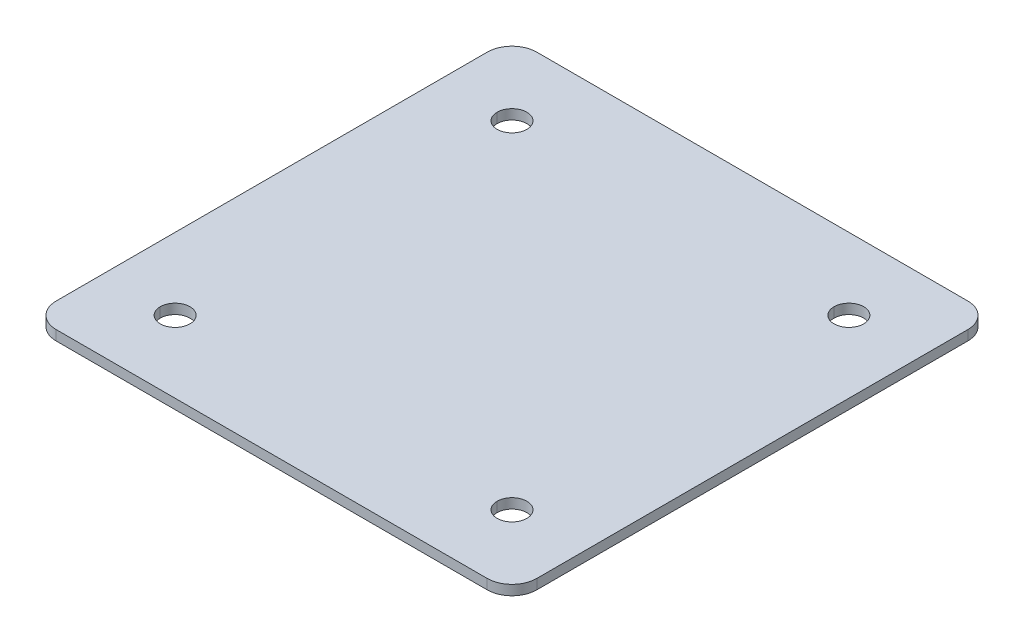
ISO-10303-21;
HEADER;
FILE_DESCRIPTION(('STEP AP214'),'2;1');
FILE_NAME('part.step','',(''),(''),'','','');
FILE_SCHEMA(('AUTOMOTIVE_DESIGN { 1 0 10303 214 1 1 1 1 }'));
ENDSEC;
DATA;
#1=APPLICATION_CONTEXT('core data for automotive mechanical design processes');
#2=APPLICATION_PROTOCOL_DEFINITION('international standard','automotive_design',2000,#1);
#3=PRODUCT_CONTEXT('',#1,'mechanical');
#4=PRODUCT('Part','Part','',(#3));
#5=PRODUCT_RELATED_PRODUCT_CATEGORY('part','',(#4));
#6=PRODUCT_DEFINITION_FORMATION('','',#4);
#7=PRODUCT_DEFINITION_CONTEXT('part definition',#1,'design');
#8=PRODUCT_DEFINITION('design','',#6,#7);
#9=PRODUCT_DEFINITION_SHAPE('','',#8);
#10=(LENGTH_UNIT() NAMED_UNIT(*) SI_UNIT(.MILLI.,.METRE.));
#11=(NAMED_UNIT(*) PLANE_ANGLE_UNIT() SI_UNIT($,.RADIAN.));
#12=(NAMED_UNIT(*) SI_UNIT($,.STERADIAN.) SOLID_ANGLE_UNIT());
#13=UNCERTAINTY_MEASURE_WITH_UNIT(LENGTH_MEASURE(1.E-05),#10,'distance_accuracy_value','');
#14=(GEOMETRIC_REPRESENTATION_CONTEXT(3) GLOBAL_UNCERTAINTY_ASSIGNED_CONTEXT((#13)) GLOBAL_UNIT_ASSIGNED_CONTEXT((#10,
#11,#12)) REPRESENTATION_CONTEXT('',''));
#15=CARTESIAN_POINT('',(0.,0.,0.));
#16=DIRECTION('',(0.,0.,1.));
#17=DIRECTION('',(1.,0.,0.));
#18=AXIS2_PLACEMENT_3D('',#15,#16,#17);
#19=CARTESIAN_POINT('',(16.,109.,34.));
#20=DIRECTION('',(0.,1.,0.));
#21=DIRECTION('',(-1.,0.,0.));
#22=AXIS2_PLACEMENT_3D('',#19,#20,#21);
#23=CYLINDRICAL_SURFACE('',#22,3.);
#24=DIRECTION('',(0.,1.,0.));
#25=VECTOR('',#24,1.);
#26=CARTESIAN_POINT('',(19.,109.,34.));
#27=LINE('',#26,#25);
#28=CARTESIAN_POINT('',(19.,109.,34.));
#29=VERTEX_POINT('',#28);
#30=CARTESIAN_POINT('',(19.,111.,34.));
#31=VERTEX_POINT('',#30);
#32=EDGE_CURVE('E327',#29,#31,#27,.T.);
#33=ORIENTED_EDGE('',*,*,#32,.F.);
#34=CARTESIAN_POINT('',(16.,109.,34.));
#35=DIRECTION('',(0.,-1.,0.));
#36=DIRECTION('',(1.,0.,0.));
#37=AXIS2_PLACEMENT_3D('',#34,#35,#36);
#38=CIRCLE('',#37,3.);
#39=CARTESIAN_POINT('',(13.,109.,34.));
#40=VERTEX_POINT('',#39);
#41=EDGE_CURVE('E178',#29,#40,#38,.T.);
#42=ORIENTED_EDGE('',*,*,#41,.T.);
#43=DIRECTION('',(0.,1.,0.));
#44=VECTOR('',#43,1.);
#45=CARTESIAN_POINT('',(13.,109.,34.));
#46=LINE('',#45,#44);
#47=CARTESIAN_POINT('',(13.,111.,34.));
#48=VERTEX_POINT('',#47);
#49=EDGE_CURVE('E345',#40,#48,#46,.T.);
#50=ORIENTED_EDGE('',*,*,#49,.T.);
#51=CARTESIAN_POINT('',(16.,111.,34.));
#52=DIRECTION('',(0.,-1.,0.));
#53=DIRECTION('',(1.,0.,0.));
#54=AXIS2_PLACEMENT_3D('',#51,#52,#53);
#55=CIRCLE('',#54,3.);
#56=EDGE_CURVE('E275',#31,#48,#55,.T.);
#57=ORIENTED_EDGE('',*,*,#56,.F.);
#58=EDGE_LOOP('',(#33,#42,#50,#57));
#59=FACE_BOUND('',#58,.T.);
#60=ADVANCED_FACE('F17',(#59),#23,.F.);
#61=CARTESIAN_POINT('',(16.,109.,-34.));
#62=DIRECTION('',(0.,1.,0.));
#63=DIRECTION('',(-1.,0.,0.));
#64=AXIS2_PLACEMENT_3D('',#61,#62,#63);
#65=CYLINDRICAL_SURFACE('',#64,3.);
#66=DIRECTION('',(0.,1.,0.));
#67=VECTOR('',#66,1.);
#68=CARTESIAN_POINT('',(19.,109.,-34.));
#69=LINE('',#68,#67);
#70=CARTESIAN_POINT('',(19.,109.,-34.));
#71=VERTEX_POINT('',#70);
#72=CARTESIAN_POINT('',(19.,111.,-34.));
#73=VERTEX_POINT('',#72);
#74=EDGE_CURVE('E365',#71,#73,#69,.T.);
#75=ORIENTED_EDGE('',*,*,#74,.F.);
#76=CARTESIAN_POINT('',(16.,109.,-34.));
#77=DIRECTION('',(0.,1.,0.));
#78=DIRECTION('',(1.,0.,0.));
#79=AXIS2_PLACEMENT_3D('',#76,#77,#78);
#80=CIRCLE('',#79,3.);
#81=CARTESIAN_POINT('',(13.,109.,-34.));
#82=VERTEX_POINT('',#81);
#83=EDGE_CURVE('E174',#82,#71,#80,.T.);
#84=ORIENTED_EDGE('',*,*,#83,.F.);
#85=DIRECTION('',(0.,1.,0.));
#86=VECTOR('',#85,1.);
#87=CARTESIAN_POINT('',(13.,109.,-34.));
#88=LINE('',#87,#86);
#89=CARTESIAN_POINT('',(13.,111.,-34.));
#90=VERTEX_POINT('',#89);
#91=EDGE_CURVE('E216',#82,#90,#88,.T.);
#92=ORIENTED_EDGE('',*,*,#91,.T.);
#93=CARTESIAN_POINT('',(16.,111.,-34.));
#94=DIRECTION('',(0.,1.,0.));
#95=DIRECTION('',(1.,0.,0.));
#96=AXIS2_PLACEMENT_3D('',#93,#94,#95);
#97=CIRCLE('',#96,3.);
#98=EDGE_CURVE('E272',#90,#73,#97,.T.);
#99=ORIENTED_EDGE('',*,*,#98,.T.);
#100=EDGE_LOOP('',(#75,#84,#92,#99));
#101=FACE_BOUND('',#100,.T.);
#102=ADVANCED_FACE('F316',(#101),#65,.F.);
#103=CARTESIAN_POINT('',(84.,109.,-34.));
#104=DIRECTION('',(0.,1.,0.));
#105=DIRECTION('',(-1.,0.,0.));
#106=AXIS2_PLACEMENT_3D('',#103,#104,#105);
#107=CYLINDRICAL_SURFACE('',#106,3.);
#108=DIRECTION('',(0.,1.,0.));
#109=VECTOR('',#108,1.);
#110=CARTESIAN_POINT('',(87.,109.,-34.));
#111=LINE('',#110,#109);
#112=CARTESIAN_POINT('',(87.,109.,-34.));
#113=VERTEX_POINT('',#112);
#114=CARTESIAN_POINT('',(87.,111.,-34.));
#115=VERTEX_POINT('',#114);
#116=EDGE_CURVE('E224',#113,#115,#111,.T.);
#117=ORIENTED_EDGE('',*,*,#116,.F.);
#118=CARTESIAN_POINT('',(84.,109.,-34.));
#119=DIRECTION('',(0.,-1.,0.));
#120=DIRECTION('',(-1.,0.,0.));
#121=AXIS2_PLACEMENT_3D('',#118,#119,#120);
#122=CIRCLE('',#121,3.);
#123=CARTESIAN_POINT('',(81.,109.,-34.));
#124=VERTEX_POINT('',#123);
#125=EDGE_CURVE('E215',#113,#124,#122,.T.);
#126=ORIENTED_EDGE('',*,*,#125,.T.);
#127=DIRECTION('',(0.,1.,0.));
#128=VECTOR('',#127,1.);
#129=CARTESIAN_POINT('',(81.,109.,-34.));
#130=LINE('',#129,#128);
#131=CARTESIAN_POINT('',(81.,111.,-34.));
#132=VERTEX_POINT('',#131);
#133=EDGE_CURVE('E225',#124,#132,#130,.T.);
#134=ORIENTED_EDGE('',*,*,#133,.T.);
#135=CARTESIAN_POINT('',(84.,111.,-34.));
#136=DIRECTION('',(0.,-1.,0.));
#137=DIRECTION('',(-1.,0.,0.));
#138=AXIS2_PLACEMENT_3D('',#135,#136,#137);
#139=CIRCLE('',#138,3.);
#140=EDGE_CURVE('E266',#115,#132,#139,.T.);
#141=ORIENTED_EDGE('',*,*,#140,.F.);
#142=EDGE_LOOP('',(#117,#126,#134,#141));
#143=FACE_BOUND('',#142,.T.);
#144=ADVANCED_FACE('F321',(#143),#107,.F.);
#145=CARTESIAN_POINT('',(84.,109.,34.));
#146=DIRECTION('',(0.,1.,0.));
#147=DIRECTION('',(-1.,0.,0.));
#148=AXIS2_PLACEMENT_3D('',#145,#146,#147);
#149=CYLINDRICAL_SURFACE('',#148,3.);
#150=DIRECTION('',(0.,1.,0.));
#151=VECTOR('',#150,1.);
#152=CARTESIAN_POINT('',(87.,109.,34.));
#153=LINE('',#152,#151);
#154=CARTESIAN_POINT('',(87.,109.,34.));
#155=VERTEX_POINT('',#154);
#156=CARTESIAN_POINT('',(87.,111.,34.));
#157=VERTEX_POINT('',#156);
#158=EDGE_CURVE('E212',#155,#157,#153,.T.);
#159=ORIENTED_EDGE('',*,*,#158,.F.);
#160=CARTESIAN_POINT('',(84.,109.,34.));
#161=DIRECTION('',(0.,1.,0.));
#162=DIRECTION('',(-1.,0.,0.));
#163=AXIS2_PLACEMENT_3D('',#160,#161,#162);
#164=CIRCLE('',#163,3.);
#165=CARTESIAN_POINT('',(81.,109.,34.));
#166=VERTEX_POINT('',#165);
#167=EDGE_CURVE('E179',#166,#155,#164,.T.);
#168=ORIENTED_EDGE('',*,*,#167,.F.);
#169=DIRECTION('',(0.,1.,0.));
#170=VECTOR('',#169,1.);
#171=CARTESIAN_POINT('',(81.,109.,34.));
#172=LINE('',#171,#170);
#173=CARTESIAN_POINT('',(81.,111.,34.));
#174=VERTEX_POINT('',#173);
#175=EDGE_CURVE('E211',#166,#174,#172,.T.);
#176=ORIENTED_EDGE('',*,*,#175,.T.);
#177=CARTESIAN_POINT('',(84.,111.,34.));
#178=DIRECTION('',(0.,1.,0.));
#179=DIRECTION('',(-1.,0.,0.));
#180=AXIS2_PLACEMENT_3D('',#177,#178,#179);
#181=CIRCLE('',#180,3.);
#182=EDGE_CURVE('E269',#174,#157,#181,.T.);
#183=ORIENTED_EDGE('',*,*,#182,.T.);
#184=EDGE_LOOP('',(#159,#168,#176,#183));
#185=FACE_BOUND('',#184,.T.);
#186=ADVANCED_FACE('F312',(#185),#149,.F.);
#187=CARTESIAN_POINT('',(6.5,111.,43.5));
#188=DIRECTION('',(0.,-1.,0.));
#189=DIRECTION('',(1.,0.,0.));
#190=AXIS2_PLACEMENT_3D('',#187,#188,#189);
#191=CYLINDRICAL_SURFACE('',#190,5.);
#192=CARTESIAN_POINT('',(6.5,111.,43.5));
#193=DIRECTION('',(0.,1.,0.));
#194=DIRECTION('',(-1.,0.,0.));
#195=AXIS2_PLACEMENT_3D('',#192,#193,#194);
#196=CIRCLE('',#195,5.);
#197=CARTESIAN_POINT('',(1.49999999999997,111.,43.5));
#198=VERTEX_POINT('',#197);
#199=CARTESIAN_POINT('',(6.5,111.,48.5));
#200=VERTEX_POINT('',#199);
#201=EDGE_CURVE('E257',#198,#200,#196,.T.);
#202=ORIENTED_EDGE('',*,*,#201,.F.);
#203=DIRECTION('',(0.,1.,0.));
#204=VECTOR('',#203,1.);
#205=CARTESIAN_POINT('',(1.49999999999997,111.,43.5));
#206=LINE('',#205,#204);
#207=CARTESIAN_POINT('',(1.49999999999997,109.,43.5));
#208=VERTEX_POINT('',#207);
#209=EDGE_CURVE('E152',#208,#198,#206,.T.);
#210=ORIENTED_EDGE('',*,*,#209,.F.);
#211=CARTESIAN_POINT('',(6.5,109.,43.5));
#212=DIRECTION('',(0.,-1.,0.));
#213=DIRECTION('',(-1.,0.,0.));
#214=AXIS2_PLACEMENT_3D('',#211,#212,#213);
#215=CIRCLE('',#214,5.);
#216=CARTESIAN_POINT('',(6.5,109.,48.5));
#217=VERTEX_POINT('',#216);
#218=EDGE_CURVE('E150',#217,#208,#215,.T.);
#219=ORIENTED_EDGE('',*,*,#218,.F.);
#220=DIRECTION('',(0.,-1.,0.));
#221=VECTOR('',#220,1.);
#222=CARTESIAN_POINT('',(6.5,111.,48.5));
#223=LINE('',#222,#221);
#224=EDGE_CURVE('E11',#200,#217,#223,.T.);
#225=ORIENTED_EDGE('',*,*,#224,.F.);
#226=EDGE_LOOP('',(#202,#210,#219,#225));
#227=FACE_BOUND('',#226,.T.);
#228=ADVANCED_FACE('F151',(#227),#191,.T.);
#229=CARTESIAN_POINT('',(93.5,111.,43.5));
#230=DIRECTION('',(0.,-1.,0.));
#231=DIRECTION('',(1.,0.,0.));
#232=AXIS2_PLACEMENT_3D('',#229,#230,#231);
#233=CYLINDRICAL_SURFACE('',#232,5.);
#234=CARTESIAN_POINT('',(93.5,111.,43.5));
#235=DIRECTION('',(0.,1.,0.));
#236=DIRECTION('',(-1.,0.,0.));
#237=AXIS2_PLACEMENT_3D('',#234,#235,#236);
#238=CIRCLE('',#237,5.);
#239=CARTESIAN_POINT('',(93.5,111.,48.5));
#240=VERTEX_POINT('',#239);
#241=CARTESIAN_POINT('',(98.5,111.,43.5));
#242=VERTEX_POINT('',#241);
#243=EDGE_CURVE('E262',#240,#242,#238,.T.);
#244=ORIENTED_EDGE('',*,*,#243,.F.);
#245=DIRECTION('',(0.,1.,0.));
#246=VECTOR('',#245,1.);
#247=CARTESIAN_POINT('',(93.5,111.,48.5));
#248=LINE('',#247,#246);
#249=CARTESIAN_POINT('',(93.5,109.,48.5));
#250=VERTEX_POINT('',#249);
#251=EDGE_CURVE('E26',#250,#240,#248,.T.);
#252=ORIENTED_EDGE('',*,*,#251,.F.);
#253=CARTESIAN_POINT('',(93.5,109.,43.5));
#254=DIRECTION('',(0.,-1.,0.));
#255=DIRECTION('',(-1.,0.,0.));
#256=AXIS2_PLACEMENT_3D('',#253,#254,#255);
#257=CIRCLE('',#256,5.);
#258=CARTESIAN_POINT('',(98.5,109.,43.5));
#259=VERTEX_POINT('',#258);
#260=EDGE_CURVE('E162',#259,#250,#257,.T.);
#261=ORIENTED_EDGE('',*,*,#260,.F.);
#262=DIRECTION('',(0.,-1.,0.));
#263=VECTOR('',#262,1.);
#264=CARTESIAN_POINT('',(98.5,111.,43.5));
#265=LINE('',#264,#263);
#266=EDGE_CURVE('E186',#242,#259,#265,.T.);
#267=ORIENTED_EDGE('',*,*,#266,.F.);
#268=EDGE_LOOP('',(#244,#252,#261,#267));
#269=FACE_BOUND('',#268,.T.);
#270=ADVANCED_FACE('F301',(#269),#233,.T.);
#271=CARTESIAN_POINT('',(6.5,111.,-43.5));
#272=DIRECTION('',(0.,-1.,0.));
#273=DIRECTION('',(1.,0.,0.));
#274=AXIS2_PLACEMENT_3D('',#271,#272,#273);
#275=CYLINDRICAL_SURFACE('',#274,5.);
#276=CARTESIAN_POINT('',(6.5,111.,-43.5));
#277=DIRECTION('',(0.,1.,0.));
#278=DIRECTION('',(-1.,0.,0.));
#279=AXIS2_PLACEMENT_3D('',#276,#277,#278);
#280=CIRCLE('',#279,5.);
#281=CARTESIAN_POINT('',(6.5,111.,-48.5));
#282=VERTEX_POINT('',#281);
#283=CARTESIAN_POINT('',(1.49999999999996,111.,-43.5));
#284=VERTEX_POINT('',#283);
#285=EDGE_CURVE('E249',#282,#284,#280,.T.);
#286=ORIENTED_EDGE('',*,*,#285,.F.);
#287=DIRECTION('',(0.,1.,0.));
#288=VECTOR('',#287,1.);
#289=CARTESIAN_POINT('',(6.5,111.,-48.5));
#290=LINE('',#289,#288);
#291=CARTESIAN_POINT('',(6.5,109.,-48.5));
#292=VERTEX_POINT('',#291);
#293=EDGE_CURVE('E192',#292,#282,#290,.T.);
#294=ORIENTED_EDGE('',*,*,#293,.F.);
#295=CARTESIAN_POINT('',(6.5,109.,-43.5));
#296=DIRECTION('',(0.,-1.,0.));
#297=DIRECTION('',(-1.,0.,0.));
#298=AXIS2_PLACEMENT_3D('',#295,#296,#297);
#299=CIRCLE('',#298,5.);
#300=CARTESIAN_POINT('',(1.49999999999996,109.,-43.5));
#301=VERTEX_POINT('',#300);
#302=EDGE_CURVE('E173',#301,#292,#299,.T.);
#303=ORIENTED_EDGE('',*,*,#302,.F.);
#304=DIRECTION('',(0.,-1.,0.));
#305=VECTOR('',#304,1.);
#306=CARTESIAN_POINT('',(1.49999999999996,111.,-43.5));
#307=LINE('',#306,#305);
#308=EDGE_CURVE('E38',#284,#301,#307,.T.);
#309=ORIENTED_EDGE('',*,*,#308,.F.);
#310=EDGE_LOOP('',(#286,#294,#303,#309));
#311=FACE_BOUND('',#310,.T.);
#312=ADVANCED_FACE('F303',(#311),#275,.T.);
#313=CARTESIAN_POINT('',(93.5,111.,-43.5));
#314=DIRECTION('',(0.,-1.,0.));
#315=DIRECTION('',(1.,0.,0.));
#316=AXIS2_PLACEMENT_3D('',#313,#314,#315);
#317=CYLINDRICAL_SURFACE('',#316,5.);
#318=CARTESIAN_POINT('',(93.5,111.,-43.5));
#319=DIRECTION('',(0.,1.,0.));
#320=DIRECTION('',(-1.,0.,0.));
#321=AXIS2_PLACEMENT_3D('',#318,#319,#320);
#322=CIRCLE('',#321,5.);
#323=CARTESIAN_POINT('',(98.5,111.,-43.5));
#324=VERTEX_POINT('',#323);
#325=CARTESIAN_POINT('',(93.5,111.,-48.5));
#326=VERTEX_POINT('',#325);
#327=EDGE_CURVE('E241',#324,#326,#322,.T.);
#328=ORIENTED_EDGE('',*,*,#327,.F.);
#329=DIRECTION('',(0.,1.,0.));
#330=VECTOR('',#329,1.);
#331=CARTESIAN_POINT('',(98.5,111.,-43.5));
#332=LINE('',#331,#330);
#333=CARTESIAN_POINT('',(98.5,109.,-43.5));
#334=VERTEX_POINT('',#333);
#335=EDGE_CURVE('E183',#334,#324,#332,.T.);
#336=ORIENTED_EDGE('',*,*,#335,.F.);
#337=CARTESIAN_POINT('',(93.5,109.,-43.5));
#338=DIRECTION('',(0.,-1.,0.));
#339=DIRECTION('',(-1.,0.,0.));
#340=AXIS2_PLACEMENT_3D('',#337,#338,#339);
#341=CIRCLE('',#340,5.);
#342=CARTESIAN_POINT('',(93.5,109.,-48.5));
#343=VERTEX_POINT('',#342);
#344=EDGE_CURVE('E283',#343,#334,#341,.T.);
#345=ORIENTED_EDGE('',*,*,#344,.F.);
#346=DIRECTION('',(0.,-1.,0.));
#347=VECTOR('',#346,1.);
#348=CARTESIAN_POINT('',(93.5,111.,-48.5));
#349=LINE('',#348,#347);
#350=EDGE_CURVE('E189',#326,#343,#349,.T.);
#351=ORIENTED_EDGE('',*,*,#350,.F.);
#352=EDGE_LOOP('',(#328,#336,#345,#351));
#353=FACE_BOUND('',#352,.T.);
#354=ADVANCED_FACE('F296',(#353),#317,.T.);
#355=CARTESIAN_POINT('',(98.5,111.,48.5));
#356=DIRECTION('',(0.,0.,-1.));
#357=DIRECTION('',(0.,-1.,0.));
#358=AXIS2_PLACEMENT_3D('',#355,#356,#357);
#359=PLANE('',#358);
#360=DIRECTION('',(1.,0.,0.));
#361=VECTOR('',#360,1.);
#362=CARTESIAN_POINT('',(98.5,109.,48.5));
#363=LINE('',#362,#361);
#364=EDGE_CURVE('E142',#217,#250,#363,.T.);
#365=ORIENTED_EDGE('',*,*,#364,.T.);
#366=ORIENTED_EDGE('',*,*,#251,.T.);
#367=DIRECTION('',(1.,0.,0.));
#368=VECTOR('',#367,1.);
#369=CARTESIAN_POINT('',(98.5,111.,48.5));
#370=LINE('',#369,#368);
#371=EDGE_CURVE('E145',#200,#240,#370,.T.);
#372=ORIENTED_EDGE('',*,*,#371,.F.);
#373=ORIENTED_EDGE('',*,*,#224,.T.);
#374=EDGE_LOOP('',(#365,#366,#372,#373));
#375=FACE_BOUND('',#374,.T.);
#376=ADVANCED_FACE('F140',(#375),#359,.F.);
#377=CARTESIAN_POINT('',(1.49999999999997,111.,48.5));
#378=DIRECTION('',(1.,0.,0.));
#379=DIRECTION('',(0.,0.,1.));
#380=AXIS2_PLACEMENT_3D('',#377,#378,#379);
#381=PLANE('',#380);
#382=DIRECTION('',(0.,0.,1.));
#383=VECTOR('',#382,1.);
#384=CARTESIAN_POINT('',(1.49999999999997,111.,48.5));
#385=LINE('',#384,#383);
#386=EDGE_CURVE('E253',#284,#198,#385,.T.);
#387=ORIENTED_EDGE('',*,*,#386,.F.);
#388=ORIENTED_EDGE('',*,*,#308,.T.);
#389=DIRECTION('',(0.,0.,1.));
#390=VECTOR('',#389,1.);
#391=CARTESIAN_POINT('',(1.49999999999997,109.,48.5));
#392=LINE('',#391,#390);
#393=EDGE_CURVE('E156',#301,#208,#392,.T.);
#394=ORIENTED_EDGE('',*,*,#393,.T.);
#395=ORIENTED_EDGE('',*,*,#209,.T.);
#396=EDGE_LOOP('',(#387,#388,#394,#395));
#397=FACE_BOUND('',#396,.T.);
#398=ADVANCED_FACE('F401',(#397),#381,.F.);
#399=CARTESIAN_POINT('',(98.5,111.,-48.5));
#400=DIRECTION('',(0.,0.,1.));
#401=DIRECTION('',(-1.,0.,0.));
#402=AXIS2_PLACEMENT_3D('',#399,#400,#401);
#403=PLANE('',#402);
#404=DIRECTION('',(-1.,0.,0.));
#405=VECTOR('',#404,1.);
#406=CARTESIAN_POINT('',(98.5,111.,-48.5));
#407=LINE('',#406,#405);
#408=EDGE_CURVE('E245',#326,#282,#407,.T.);
#409=ORIENTED_EDGE('',*,*,#408,.F.);
#410=ORIENTED_EDGE('',*,*,#350,.T.);
#411=DIRECTION('',(-1.,0.,0.));
#412=VECTOR('',#411,1.);
#413=CARTESIAN_POINT('',(98.5,109.,-48.5));
#414=LINE('',#413,#412);
#415=EDGE_CURVE('E279',#343,#292,#414,.T.);
#416=ORIENTED_EDGE('',*,*,#415,.T.);
#417=ORIENTED_EDGE('',*,*,#293,.T.);
#418=EDGE_LOOP('',(#409,#410,#416,#417));
#419=FACE_BOUND('',#418,.T.);
#420=ADVANCED_FACE('F394',(#419),#403,.F.);
#421=CARTESIAN_POINT('',(98.5,111.,48.5));
#422=DIRECTION('',(-1.,0.,0.));
#423=DIRECTION('',(0.,0.,1.));
#424=AXIS2_PLACEMENT_3D('',#421,#422,#423);
#425=PLANE('',#424);
#426=DIRECTION('',(0.,0.,-1.));
#427=VECTOR('',#426,1.);
#428=CARTESIAN_POINT('',(98.5,109.,48.5));
#429=LINE('',#428,#427);
#430=EDGE_CURVE('E167',#259,#334,#429,.T.);
#431=ORIENTED_EDGE('',*,*,#430,.T.);
#432=ORIENTED_EDGE('',*,*,#335,.T.);
#433=DIRECTION('',(0.,0.,-1.));
#434=VECTOR('',#433,1.);
#435=CARTESIAN_POINT('',(98.5,111.,48.5));
#436=LINE('',#435,#434);
#437=EDGE_CURVE('E237',#242,#324,#436,.T.);
#438=ORIENTED_EDGE('',*,*,#437,.F.);
#439=ORIENTED_EDGE('',*,*,#266,.T.);
#440=EDGE_LOOP('',(#431,#432,#438,#439));
#441=FACE_BOUND('',#440,.T.);
#442=ADVANCED_FACE('F290',(#441),#425,.F.);
#443=CARTESIAN_POINT('',(50.,109.,0.));
#444=DIRECTION('',(0.,1.,0.));
#445=DIRECTION('',(-1.,0.,0.));
#446=AXIS2_PLACEMENT_3D('',#443,#444,#445);
#447=PLANE('',#446);
#448=CARTESIAN_POINT('',(16.,109.,34.));
#449=DIRECTION('',(0.,-1.,0.));
#450=DIRECTION('',(1.,0.,0.));
#451=AXIS2_PLACEMENT_3D('',#448,#449,#450);
#452=CIRCLE('',#451,3.);
#453=EDGE_CURVE('E341',#40,#29,#452,.T.);
#454=ORIENTED_EDGE('',*,*,#453,.F.);
#455=ORIENTED_EDGE('',*,*,#41,.F.);
#456=EDGE_LOOP('',(#454,#455));
#457=FACE_BOUND('',#456,.T.);
#458=ORIENTED_EDGE('',*,*,#83,.T.);
#459=CARTESIAN_POINT('',(16.,109.,-34.));
#460=DIRECTION('',(0.,1.,0.));
#461=DIRECTION('',(1.,0.,0.));
#462=AXIS2_PLACEMENT_3D('',#459,#460,#461);
#463=CIRCLE('',#462,3.);
#464=EDGE_CURVE('E361',#71,#82,#463,.T.);
#465=ORIENTED_EDGE('',*,*,#464,.T.);
#466=EDGE_LOOP('',(#458,#465));
#467=FACE_BOUND('',#466,.T.);
#468=ORIENTED_EDGE('',*,*,#167,.T.);
#469=CARTESIAN_POINT('',(84.,109.,34.));
#470=DIRECTION('',(0.,1.,0.));
#471=DIRECTION('',(-1.,0.,0.));
#472=AXIS2_PLACEMENT_3D('',#469,#470,#471);
#473=CIRCLE('',#472,3.);
#474=EDGE_CURVE('E229',#155,#166,#473,.T.);
#475=ORIENTED_EDGE('',*,*,#474,.T.);
#476=EDGE_LOOP('',(#468,#475));
#477=FACE_BOUND('',#476,.T.);
#478=CARTESIAN_POINT('',(84.,109.,-34.));
#479=DIRECTION('',(0.,-1.,0.));
#480=DIRECTION('',(-1.,0.,0.));
#481=AXIS2_PLACEMENT_3D('',#478,#479,#480);
#482=CIRCLE('',#481,3.);
#483=EDGE_CURVE('E220',#124,#113,#482,.T.);
#484=ORIENTED_EDGE('',*,*,#483,.F.);
#485=ORIENTED_EDGE('',*,*,#125,.F.);
#486=EDGE_LOOP('',(#484,#485));
#487=FACE_BOUND('',#486,.T.);
#488=ORIENTED_EDGE('',*,*,#415,.F.);
#489=ORIENTED_EDGE('',*,*,#344,.T.);
#490=ORIENTED_EDGE('',*,*,#430,.F.);
#491=ORIENTED_EDGE('',*,*,#260,.T.);
#492=ORIENTED_EDGE('',*,*,#364,.F.);
#493=ORIENTED_EDGE('',*,*,#218,.T.);
#494=ORIENTED_EDGE('',*,*,#393,.F.);
#495=ORIENTED_EDGE('',*,*,#302,.T.);
#496=EDGE_LOOP('',(#488,#489,#490,#491,#492,#493,#494,#495));
#497=FACE_BOUND('',#496,.T.);
#498=ADVANCED_FACE('F159',(#457,#467,#477,#487,#497),#447,.F.);
#499=CARTESIAN_POINT('',(50.,111.,0.));
#500=DIRECTION('',(0.,1.,0.));
#501=DIRECTION('',(-1.,0.,0.));
#502=AXIS2_PLACEMENT_3D('',#499,#500,#501);
#503=PLANE('',#502);
#504=CARTESIAN_POINT('',(16.,111.,34.));
#505=DIRECTION('',(0.,-1.,0.));
#506=DIRECTION('',(1.,0.,0.));
#507=AXIS2_PLACEMENT_3D('',#504,#505,#506);
#508=CIRCLE('',#507,3.);
#509=EDGE_CURVE('E340',#48,#31,#508,.T.);
#510=ORIENTED_EDGE('',*,*,#509,.T.);
#511=ORIENTED_EDGE('',*,*,#56,.T.);
#512=EDGE_LOOP('',(#510,#511));
#513=FACE_BOUND('',#512,.T.);
#514=ORIENTED_EDGE('',*,*,#98,.F.);
#515=CARTESIAN_POINT('',(16.,111.,-34.));
#516=DIRECTION('',(0.,1.,0.));
#517=DIRECTION('',(1.,0.,0.));
#518=AXIS2_PLACEMENT_3D('',#515,#516,#517);
#519=CIRCLE('',#518,3.);
#520=EDGE_CURVE('E206',#73,#90,#519,.T.);
#521=ORIENTED_EDGE('',*,*,#520,.F.);
#522=EDGE_LOOP('',(#514,#521));
#523=FACE_BOUND('',#522,.T.);
#524=ORIENTED_EDGE('',*,*,#182,.F.);
#525=CARTESIAN_POINT('',(84.,111.,34.));
#526=DIRECTION('',(0.,1.,0.));
#527=DIRECTION('',(-1.,0.,0.));
#528=AXIS2_PLACEMENT_3D('',#525,#526,#527);
#529=CIRCLE('',#528,3.);
#530=EDGE_CURVE('E208',#157,#174,#529,.T.);
#531=ORIENTED_EDGE('',*,*,#530,.F.);
#532=EDGE_LOOP('',(#524,#531));
#533=FACE_BOUND('',#532,.T.);
#534=CARTESIAN_POINT('',(84.,111.,-34.));
#535=DIRECTION('',(0.,-1.,0.));
#536=DIRECTION('',(-1.,0.,0.));
#537=AXIS2_PLACEMENT_3D('',#534,#535,#536);
#538=CIRCLE('',#537,3.);
#539=EDGE_CURVE('E230',#132,#115,#538,.T.);
#540=ORIENTED_EDGE('',*,*,#539,.T.);
#541=ORIENTED_EDGE('',*,*,#140,.T.);
#542=EDGE_LOOP('',(#540,#541));
#543=FACE_BOUND('',#542,.T.);
#544=ORIENTED_EDGE('',*,*,#437,.T.);
#545=ORIENTED_EDGE('',*,*,#327,.T.);
#546=ORIENTED_EDGE('',*,*,#408,.T.);
#547=ORIENTED_EDGE('',*,*,#285,.T.);
#548=ORIENTED_EDGE('',*,*,#386,.T.);
#549=ORIENTED_EDGE('',*,*,#201,.T.);
#550=ORIENTED_EDGE('',*,*,#371,.T.);
#551=ORIENTED_EDGE('',*,*,#243,.T.);
#552=EDGE_LOOP('',(#544,#545,#546,#547,#548,#549,#550,#551));
#553=FACE_BOUND('',#552,.T.);
#554=ADVANCED_FACE('F299',(#513,#523,#533,#543,#553),#503,.T.);
#555=CARTESIAN_POINT('',(84.,109.,34.));
#556=DIRECTION('',(0.,1.,0.));
#557=DIRECTION('',(-1.,0.,0.));
#558=AXIS2_PLACEMENT_3D('',#555,#556,#557);
#559=CYLINDRICAL_SURFACE('',#558,3.);
#560=ORIENTED_EDGE('',*,*,#474,.F.);
#561=ORIENTED_EDGE('',*,*,#158,.T.);
#562=ORIENTED_EDGE('',*,*,#530,.T.);
#563=ORIENTED_EDGE('',*,*,#175,.F.);
#564=EDGE_LOOP('',(#560,#561,#562,#563));
#565=FACE_BOUND('',#564,.T.);
#566=ADVANCED_FACE('F391',(#565),#559,.F.);
#567=CARTESIAN_POINT('',(84.,109.,-34.));
#568=DIRECTION('',(0.,1.,0.));
#569=DIRECTION('',(-1.,0.,0.));
#570=AXIS2_PLACEMENT_3D('',#567,#568,#569);
#571=CYLINDRICAL_SURFACE('',#570,3.);
#572=ORIENTED_EDGE('',*,*,#483,.T.);
#573=ORIENTED_EDGE('',*,*,#116,.T.);
#574=ORIENTED_EDGE('',*,*,#539,.F.);
#575=ORIENTED_EDGE('',*,*,#133,.F.);
#576=EDGE_LOOP('',(#572,#573,#574,#575));
#577=FACE_BOUND('',#576,.T.);
#578=ADVANCED_FACE('F384',(#577),#571,.F.);
#579=CARTESIAN_POINT('',(16.,109.,-34.));
#580=DIRECTION('',(0.,1.,0.));
#581=DIRECTION('',(-1.,0.,0.));
#582=AXIS2_PLACEMENT_3D('',#579,#580,#581);
#583=CYLINDRICAL_SURFACE('',#582,3.);
#584=ORIENTED_EDGE('',*,*,#464,.F.);
#585=ORIENTED_EDGE('',*,*,#74,.T.);
#586=ORIENTED_EDGE('',*,*,#520,.T.);
#587=ORIENTED_EDGE('',*,*,#91,.F.);
#588=EDGE_LOOP('',(#584,#585,#586,#587));
#589=FACE_BOUND('',#588,.T.);
#590=ADVANCED_FACE('F418',(#589),#583,.F.);
#591=CARTESIAN_POINT('',(16.,109.,34.));
#592=DIRECTION('',(0.,1.,0.));
#593=DIRECTION('',(-1.,0.,0.));
#594=AXIS2_PLACEMENT_3D('',#591,#592,#593);
#595=CYLINDRICAL_SURFACE('',#594,3.);
#596=ORIENTED_EDGE('',*,*,#453,.T.);
#597=ORIENTED_EDGE('',*,*,#32,.T.);
#598=ORIENTED_EDGE('',*,*,#509,.F.);
#599=ORIENTED_EDGE('',*,*,#49,.F.);
#600=EDGE_LOOP('',(#596,#597,#598,#599));
#601=FACE_BOUND('',#600,.T.);
#602=ADVANCED_FACE('F344',(#601),#595,.F.);
#603=CLOSED_SHELL('',(#60,#102,#144,#186,#228,#270,#312,#354,#376,#398,#420,#442,#498,#554,#566,
#578,#590,#602));
#604=MANIFOLD_SOLID_BREP('B1',#603);
#605=ADVANCED_BREP_SHAPE_REPRESENTATION('',(#18,#604),#14);
#606=SHAPE_DEFINITION_REPRESENTATION(#9,#605);
ENDSEC;
END-ISO-10303-21;
